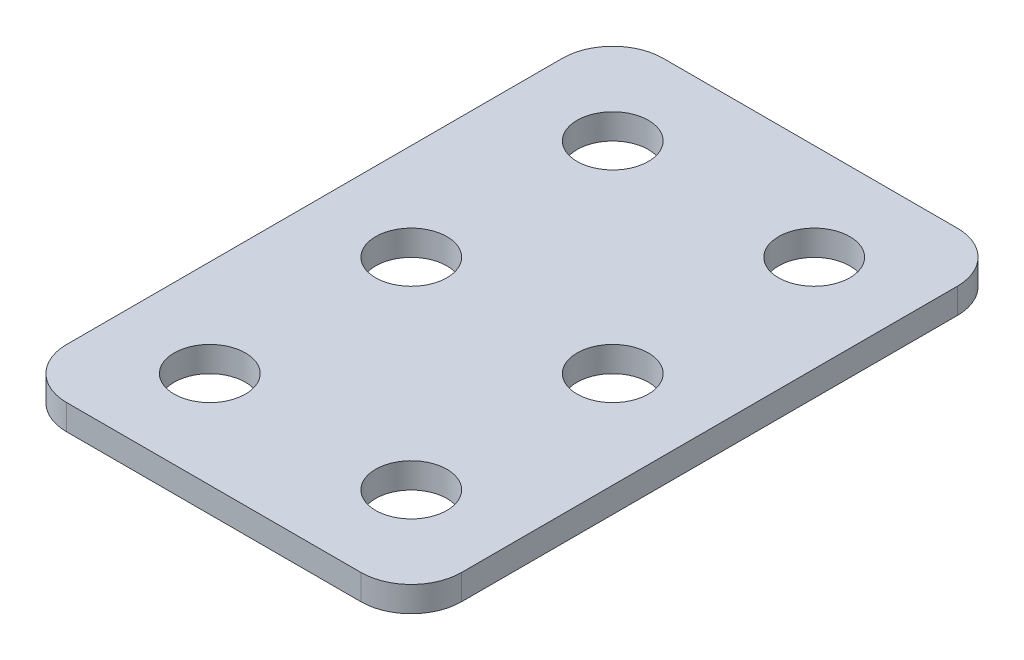
ISO-10303-21;
HEADER;
FILE_DESCRIPTION(('STEP AP214'),'2;1');
FILE_NAME('part.step','',(''),(''),'','','');
FILE_SCHEMA(('AUTOMOTIVE_DESIGN { 1 0 10303 214 1 1 1 1 }'));
ENDSEC;
DATA;
#1=APPLICATION_CONTEXT('core data for automotive mechanical design processes');
#2=APPLICATION_PROTOCOL_DEFINITION('international standard','automotive_design',2000,#1);
#3=PRODUCT_CONTEXT('',#1,'mechanical');
#4=PRODUCT('Part','Part','',(#3));
#5=PRODUCT_RELATED_PRODUCT_CATEGORY('part','',(#4));
#6=PRODUCT_DEFINITION_FORMATION('','',#4);
#7=PRODUCT_DEFINITION_CONTEXT('part definition',#1,'design');
#8=PRODUCT_DEFINITION('design','',#6,#7);
#9=PRODUCT_DEFINITION_SHAPE('','',#8);
#10=(LENGTH_UNIT() NAMED_UNIT(*) SI_UNIT(.MILLI.,.METRE.));
#11=(NAMED_UNIT(*) PLANE_ANGLE_UNIT() SI_UNIT($,.RADIAN.));
#12=(NAMED_UNIT(*) SI_UNIT($,.STERADIAN.) SOLID_ANGLE_UNIT());
#13=UNCERTAINTY_MEASURE_WITH_UNIT(LENGTH_MEASURE(1.E-05),#10,'distance_accuracy_value','');
#14=(GEOMETRIC_REPRESENTATION_CONTEXT(3) GLOBAL_UNCERTAINTY_ASSIGNED_CONTEXT((#13)) GLOBAL_UNIT_ASSIGNED_CONTEXT((#10,
#11,#12)) REPRESENTATION_CONTEXT('',''));
#15=CARTESIAN_POINT('',(0.,0.,0.));
#16=DIRECTION('',(0.,0.,1.));
#17=DIRECTION('',(1.,0.,0.));
#18=AXIS2_PLACEMENT_3D('',#15,#16,#17);
#19=CARTESIAN_POINT('',(0.,-9.5123,0.));
#20=DIRECTION('',(0.,-1.,0.));
#21=DIRECTION('',(1.,0.,0.));
#22=AXIS2_PLACEMENT_3D('',#19,#20,#21);
#23=PLANE('',#22);
#24=CARTESIAN_POINT('',(-6.35,-9.5123,-25.4));
#25=DIRECTION('',(0.,1.,0.));
#26=DIRECTION('',(-1.,0.,0.));
#27=AXIS2_PLACEMENT_3D('',#24,#25,#26);
#28=CIRCLE('',#27,2.2479);
#29=CARTESIAN_POINT('',(-8.5979,-9.5123,-25.4));
#30=VERTEX_POINT('',#29);
#31=EDGE_CURVE('E125',#30,#30,#28,.T.);
#32=ORIENTED_EDGE('',*,*,#31,.F.);
#33=EDGE_LOOP('',(#32));
#34=FACE_BOUND('',#33,.T.);
#35=CARTESIAN_POINT('',(6.35,-9.5123,-25.4));
#36=DIRECTION('',(0.,1.,0.));
#37=DIRECTION('',(-1.,0.,0.));
#38=AXIS2_PLACEMENT_3D('',#35,#36,#37);
#39=CIRCLE('',#38,2.2479);
#40=CARTESIAN_POINT('',(4.1021,-9.5123,-25.4));
#41=VERTEX_POINT('',#40);
#42=EDGE_CURVE('E185',#41,#41,#39,.T.);
#43=ORIENTED_EDGE('',*,*,#42,.F.);
#44=EDGE_LOOP('',(#43));
#45=FACE_BOUND('',#44,.T.);
#46=CARTESIAN_POINT('',(-6.35,-9.5123,-38.1));
#47=DIRECTION('',(0.,1.,0.));
#48=DIRECTION('',(-1.,0.,0.));
#49=AXIS2_PLACEMENT_3D('',#46,#47,#48);
#50=CIRCLE('',#49,2.2479);
#51=CARTESIAN_POINT('',(-8.5979,-9.5123,-38.1));
#52=VERTEX_POINT('',#51);
#53=EDGE_CURVE('E181',#52,#52,#50,.T.);
#54=ORIENTED_EDGE('',*,*,#53,.F.);
#55=EDGE_LOOP('',(#54));
#56=FACE_BOUND('',#55,.T.);
#57=CARTESIAN_POINT('',(6.35,-9.5123,-38.1));
#58=DIRECTION('',(0.,1.,0.));
#59=DIRECTION('',(-1.,0.,0.));
#60=AXIS2_PLACEMENT_3D('',#57,#58,#59);
#61=CIRCLE('',#60,2.2479);
#62=CARTESIAN_POINT('',(4.1021,-9.5123,-38.1));
#63=VERTEX_POINT('',#62);
#64=EDGE_CURVE('E177',#63,#63,#61,.T.);
#65=ORIENTED_EDGE('',*,*,#64,.F.);
#66=EDGE_LOOP('',(#65));
#67=FACE_BOUND('',#66,.T.);
#68=CARTESIAN_POINT('',(-6.35,-9.5123,-50.8));
#69=DIRECTION('',(0.,1.,0.));
#70=DIRECTION('',(-1.,0.,0.));
#71=AXIS2_PLACEMENT_3D('',#68,#69,#70);
#72=CIRCLE('',#71,2.2479);
#73=CARTESIAN_POINT('',(-8.5979,-9.5123,-50.8));
#74=VERTEX_POINT('',#73);
#75=EDGE_CURVE('E173',#74,#74,#72,.T.);
#76=ORIENTED_EDGE('',*,*,#75,.F.);
#77=EDGE_LOOP('',(#76));
#78=FACE_BOUND('',#77,.T.);
#79=CARTESIAN_POINT('',(6.35,-9.5123,-50.8));
#80=DIRECTION('',(0.,1.,0.));
#81=DIRECTION('',(-1.,0.,0.));
#82=AXIS2_PLACEMENT_3D('',#79,#80,#81);
#83=CIRCLE('',#82,2.2479);
#84=CARTESIAN_POINT('',(4.1021,-9.5123,-50.8));
#85=VERTEX_POINT('',#84);
#86=EDGE_CURVE('E158',#85,#85,#83,.T.);
#87=ORIENTED_EDGE('',*,*,#86,.F.);
#88=EDGE_LOOP('',(#87));
#89=FACE_BOUND('',#88,.T.);
#90=DIRECTION('',(0.,0.,-1.));
#91=VECTOR('',#90,1.);
#92=CARTESIAN_POINT('',(12.446,-9.5123,-19.304));
#93=LINE('',#92,#91);
#94=CARTESIAN_POINT('',(12.446,-9.5123,-22.479));
#95=VERTEX_POINT('',#94);
#96=CARTESIAN_POINT('',(12.446,-9.5123,-53.721));
#97=VERTEX_POINT('',#96);
#98=EDGE_CURVE('E104',#95,#97,#93,.T.);
#99=ORIENTED_EDGE('',*,*,#98,.T.);
#100=CARTESIAN_POINT('',(9.271,-9.5123,-53.721));
#101=DIRECTION('',(0.,-1.,0.));
#102=DIRECTION('',(1.,0.,0.));
#103=AXIS2_PLACEMENT_3D('',#100,#101,#102);
#104=CIRCLE('',#103,3.175);
#105=CARTESIAN_POINT('',(9.271,-9.5123,-56.896));
#106=VERTEX_POINT('',#105);
#107=EDGE_CURVE('E134',#97,#106,#104,.F.);
#108=ORIENTED_EDGE('',*,*,#107,.T.);
#109=DIRECTION('',(-1.,0.,0.));
#110=VECTOR('',#109,1.);
#111=CARTESIAN_POINT('',(12.446,-9.5123,-56.896));
#112=LINE('',#111,#110);
#113=CARTESIAN_POINT('',(-9.271,-9.5123,-56.896));
#114=VERTEX_POINT('',#113);
#115=EDGE_CURVE('E164',#106,#114,#112,.T.);
#116=ORIENTED_EDGE('',*,*,#115,.T.);
#117=CARTESIAN_POINT('',(-9.271,-9.5123,-53.721));
#118=DIRECTION('',(0.,-1.,0.));
#119=DIRECTION('',(1.,0.,0.));
#120=AXIS2_PLACEMENT_3D('',#117,#118,#119);
#121=CIRCLE('',#120,3.175);
#122=CARTESIAN_POINT('',(-12.446,-9.5123,-53.721));
#123=VERTEX_POINT('',#122);
#124=EDGE_CURVE('E132',#114,#123,#121,.F.);
#125=ORIENTED_EDGE('',*,*,#124,.T.);
#126=DIRECTION('',(0.,0.,1.));
#127=VECTOR('',#126,1.);
#128=CARTESIAN_POINT('',(-12.446,-9.5123,-56.896));
#129=LINE('',#128,#127);
#130=CARTESIAN_POINT('',(-12.446,-9.5123,-22.479));
#131=VERTEX_POINT('',#130);
#132=EDGE_CURVE('E167',#123,#131,#129,.T.);
#133=ORIENTED_EDGE('',*,*,#132,.T.);
#134=CARTESIAN_POINT('',(-9.27099999999999,-9.5123,-22.479));
#135=DIRECTION('',(0.,-1.,0.));
#136=DIRECTION('',(1.,0.,0.));
#137=AXIS2_PLACEMENT_3D('',#134,#135,#136);
#138=CIRCLE('',#137,3.175);
#139=CARTESIAN_POINT('',(-9.27099999999999,-9.5123,-19.304));
#140=VERTEX_POINT('',#139);
#141=EDGE_CURVE('E110',#131,#140,#138,.F.);
#142=ORIENTED_EDGE('',*,*,#141,.T.);
#143=DIRECTION('',(1.,0.,0.));
#144=VECTOR('',#143,1.);
#145=CARTESIAN_POINT('',(-12.446,-9.5123,-19.304));
#146=LINE('',#145,#144);
#147=CARTESIAN_POINT('',(9.271,-9.5123,-19.304));
#148=VERTEX_POINT('',#147);
#149=EDGE_CURVE('E105',#140,#148,#146,.T.);
#150=ORIENTED_EDGE('',*,*,#149,.T.);
#151=CARTESIAN_POINT('',(9.271,-9.5123,-22.479));
#152=DIRECTION('',(0.,-1.,0.));
#153=DIRECTION('',(1.,0.,0.));
#154=AXIS2_PLACEMENT_3D('',#151,#152,#153);
#155=CIRCLE('',#154,3.175);
#156=EDGE_CURVE('E102',#148,#95,#155,.F.);
#157=ORIENTED_EDGE('',*,*,#156,.T.);
#158=EDGE_LOOP('',(#99,#108,#116,#125,#133,#142,#150,#157));
#159=FACE_BOUND('',#158,.T.);
#160=ADVANCED_FACE('F37',(#34,#45,#56,#67,#78,#89,#159),#23,.F.);
#161=CARTESIAN_POINT('',(0.,-11.1125,0.));
#162=DIRECTION('',(0.,-1.,0.));
#163=DIRECTION('',(1.,0.,0.));
#164=AXIS2_PLACEMENT_3D('',#161,#162,#163);
#165=PLANE('',#164);
#166=CARTESIAN_POINT('',(-6.35,-11.1125,-25.4));
#167=DIRECTION('',(0.,-1.,0.));
#168=DIRECTION('',(1.,0.,0.));
#169=AXIS2_PLACEMENT_3D('',#166,#167,#168);
#170=CIRCLE('',#169,2.2479);
#171=CARTESIAN_POINT('',(-4.1021,-11.1125,-25.4));
#172=VERTEX_POINT('',#171);
#173=EDGE_CURVE('E121',#172,#172,#170,.T.);
#174=ORIENTED_EDGE('',*,*,#173,.F.);
#175=EDGE_LOOP('',(#174));
#176=FACE_BOUND('',#175,.T.);
#177=CARTESIAN_POINT('',(6.35,-11.1125,-25.4));
#178=DIRECTION('',(0.,-1.,0.));
#179=DIRECTION('',(1.,0.,0.));
#180=AXIS2_PLACEMENT_3D('',#177,#178,#179);
#181=CIRCLE('',#180,2.2479);
#182=CARTESIAN_POINT('',(8.5979,-11.1125,-25.4));
#183=VERTEX_POINT('',#182);
#184=EDGE_CURVE('E188',#183,#183,#181,.T.);
#185=ORIENTED_EDGE('',*,*,#184,.F.);
#186=EDGE_LOOP('',(#185));
#187=FACE_BOUND('',#186,.T.);
#188=CARTESIAN_POINT('',(-6.35,-11.1125,-38.1));
#189=DIRECTION('',(0.,-1.,0.));
#190=DIRECTION('',(1.,0.,0.));
#191=AXIS2_PLACEMENT_3D('',#188,#189,#190);
#192=CIRCLE('',#191,2.2479);
#193=CARTESIAN_POINT('',(-4.1021,-11.1125,-38.1));
#194=VERTEX_POINT('',#193);
#195=EDGE_CURVE('E184',#194,#194,#192,.T.);
#196=ORIENTED_EDGE('',*,*,#195,.F.);
#197=EDGE_LOOP('',(#196));
#198=FACE_BOUND('',#197,.T.);
#199=CARTESIAN_POINT('',(6.35,-11.1125,-38.1));
#200=DIRECTION('',(0.,-1.,0.));
#201=DIRECTION('',(1.,0.,0.));
#202=AXIS2_PLACEMENT_3D('',#199,#200,#201);
#203=CIRCLE('',#202,2.2479);
#204=CARTESIAN_POINT('',(8.5979,-11.1125,-38.1));
#205=VERTEX_POINT('',#204);
#206=EDGE_CURVE('E180',#205,#205,#203,.T.);
#207=ORIENTED_EDGE('',*,*,#206,.F.);
#208=EDGE_LOOP('',(#207));
#209=FACE_BOUND('',#208,.T.);
#210=CARTESIAN_POINT('',(-6.35,-11.1125,-50.8));
#211=DIRECTION('',(0.,-1.,0.));
#212=DIRECTION('',(1.,0.,0.));
#213=AXIS2_PLACEMENT_3D('',#210,#211,#212);
#214=CIRCLE('',#213,2.2479);
#215=CARTESIAN_POINT('',(-4.1021,-11.1125,-50.8));
#216=VERTEX_POINT('',#215);
#217=EDGE_CURVE('E176',#216,#216,#214,.T.);
#218=ORIENTED_EDGE('',*,*,#217,.F.);
#219=EDGE_LOOP('',(#218));
#220=FACE_BOUND('',#219,.T.);
#221=CARTESIAN_POINT('',(6.35,-11.1125,-50.8));
#222=DIRECTION('',(0.,-1.,0.));
#223=DIRECTION('',(1.,0.,0.));
#224=AXIS2_PLACEMENT_3D('',#221,#222,#223);
#225=CIRCLE('',#224,2.2479);
#226=CARTESIAN_POINT('',(8.5979,-11.1125,-50.8));
#227=VERTEX_POINT('',#226);
#228=EDGE_CURVE('E128',#227,#227,#225,.T.);
#229=ORIENTED_EDGE('',*,*,#228,.F.);
#230=EDGE_LOOP('',(#229));
#231=FACE_BOUND('',#230,.T.);
#232=DIRECTION('',(-1.,0.,0.));
#233=VECTOR('',#232,1.);
#234=CARTESIAN_POINT('',(12.446,-11.1125,-56.896));
#235=LINE('',#234,#233);
#236=CARTESIAN_POINT('',(9.271,-11.1125,-56.896));
#237=VERTEX_POINT('',#236);
#238=CARTESIAN_POINT('',(-9.271,-11.1125,-56.896));
#239=VERTEX_POINT('',#238);
#240=EDGE_CURVE('E119',#237,#239,#235,.T.);
#241=ORIENTED_EDGE('',*,*,#240,.F.);
#242=CARTESIAN_POINT('',(9.271,-11.1125,-53.721));
#243=DIRECTION('',(0.,-1.,0.));
#244=DIRECTION('',(1.,0.,0.));
#245=AXIS2_PLACEMENT_3D('',#242,#243,#244);
#246=CIRCLE('',#245,3.175);
#247=CARTESIAN_POINT('',(12.446,-11.1125,-53.721));
#248=VERTEX_POINT('',#247);
#249=EDGE_CURVE('E146',#237,#248,#246,.T.);
#250=ORIENTED_EDGE('',*,*,#249,.T.);
#251=DIRECTION('',(0.,0.,-1.));
#252=VECTOR('',#251,1.);
#253=CARTESIAN_POINT('',(12.446,-11.1125,-19.304));
#254=LINE('',#253,#252);
#255=CARTESIAN_POINT('',(12.446,-11.1125,-22.479));
#256=VERTEX_POINT('',#255);
#257=EDGE_CURVE('E155',#256,#248,#254,.T.);
#258=ORIENTED_EDGE('',*,*,#257,.F.);
#259=CARTESIAN_POINT('',(9.271,-11.1125,-22.479));
#260=DIRECTION('',(0.,-1.,0.));
#261=DIRECTION('',(1.,0.,0.));
#262=AXIS2_PLACEMENT_3D('',#259,#260,#261);
#263=CIRCLE('',#262,3.175);
#264=CARTESIAN_POINT('',(9.271,-11.1125,-19.304));
#265=VERTEX_POINT('',#264);
#266=EDGE_CURVE('E52',#256,#265,#263,.T.);
#267=ORIENTED_EDGE('',*,*,#266,.T.);
#268=DIRECTION('',(1.,0.,0.));
#269=VECTOR('',#268,1.);
#270=CARTESIAN_POINT('',(-12.446,-11.1125,-19.304));
#271=LINE('',#270,#269);
#272=CARTESIAN_POINT('',(-9.27099999999999,-11.1125,-19.304));
#273=VERTEX_POINT('',#272);
#274=EDGE_CURVE('E153',#273,#265,#271,.T.);
#275=ORIENTED_EDGE('',*,*,#274,.F.);
#276=CARTESIAN_POINT('',(-9.27099999999999,-11.1125,-22.479));
#277=DIRECTION('',(0.,-1.,0.));
#278=DIRECTION('',(1.,0.,0.));
#279=AXIS2_PLACEMENT_3D('',#276,#277,#278);
#280=CIRCLE('',#279,3.175);
#281=CARTESIAN_POINT('',(-12.446,-11.1125,-22.479));
#282=VERTEX_POINT('',#281);
#283=EDGE_CURVE('E142',#273,#282,#280,.T.);
#284=ORIENTED_EDGE('',*,*,#283,.T.);
#285=DIRECTION('',(0.,0.,1.));
#286=VECTOR('',#285,1.);
#287=CARTESIAN_POINT('',(-12.446,-11.1125,-56.896));
#288=LINE('',#287,#286);
#289=CARTESIAN_POINT('',(-12.446,-11.1125,-53.721));
#290=VERTEX_POINT('',#289);
#291=EDGE_CURVE('E156',#290,#282,#288,.T.);
#292=ORIENTED_EDGE('',*,*,#291,.F.);
#293=CARTESIAN_POINT('',(-9.271,-11.1125,-53.721));
#294=DIRECTION('',(0.,-1.,0.));
#295=DIRECTION('',(1.,0.,0.));
#296=AXIS2_PLACEMENT_3D('',#293,#294,#295);
#297=CIRCLE('',#296,3.175);
#298=EDGE_CURVE('E144',#290,#239,#297,.T.);
#299=ORIENTED_EDGE('',*,*,#298,.T.);
#300=EDGE_LOOP('',(#241,#250,#258,#267,#275,#284,#292,#299));
#301=FACE_BOUND('',#300,.T.);
#302=ADVANCED_FACE('F202',(#176,#187,#198,#209,#220,#231,#301),#165,.T.);
#303=CARTESIAN_POINT('',(-6.35,-19.05,-25.4));
#304=DIRECTION('',(0.,1.,0.));
#305=DIRECTION('',(-1.,0.,0.));
#306=AXIS2_PLACEMENT_3D('',#303,#304,#305);
#307=CYLINDRICAL_SURFACE('',#306,2.2479);
#308=ORIENTED_EDGE('',*,*,#173,.T.);
#309=EDGE_LOOP('',(#308));
#310=FACE_BOUND('',#309,.T.);
#311=ORIENTED_EDGE('',*,*,#31,.T.);
#312=EDGE_LOOP('',(#311));
#313=FACE_BOUND('',#312,.T.);
#314=ADVANCED_FACE('F205',(#310,#313),#307,.F.);
#315=CARTESIAN_POINT('',(6.35,-19.05,-25.4));
#316=DIRECTION('',(0.,1.,0.));
#317=DIRECTION('',(-1.,0.,0.));
#318=AXIS2_PLACEMENT_3D('',#315,#316,#317);
#319=CYLINDRICAL_SURFACE('',#318,2.2479);
#320=ORIENTED_EDGE('',*,*,#184,.T.);
#321=EDGE_LOOP('',(#320));
#322=FACE_BOUND('',#321,.T.);
#323=ORIENTED_EDGE('',*,*,#42,.T.);
#324=EDGE_LOOP('',(#323));
#325=FACE_BOUND('',#324,.T.);
#326=ADVANCED_FACE('F272',(#322,#325),#319,.F.);
#327=CARTESIAN_POINT('',(-6.35,-19.05,-38.1));
#328=DIRECTION('',(0.,1.,0.));
#329=DIRECTION('',(-1.,0.,0.));
#330=AXIS2_PLACEMENT_3D('',#327,#328,#329);
#331=CYLINDRICAL_SURFACE('',#330,2.2479);
#332=ORIENTED_EDGE('',*,*,#195,.T.);
#333=EDGE_LOOP('',(#332));
#334=FACE_BOUND('',#333,.T.);
#335=ORIENTED_EDGE('',*,*,#53,.T.);
#336=EDGE_LOOP('',(#335));
#337=FACE_BOUND('',#336,.T.);
#338=ADVANCED_FACE('F269',(#334,#337),#331,.F.);
#339=CARTESIAN_POINT('',(6.35,-19.05,-38.1));
#340=DIRECTION('',(0.,1.,0.));
#341=DIRECTION('',(-1.,0.,0.));
#342=AXIS2_PLACEMENT_3D('',#339,#340,#341);
#343=CYLINDRICAL_SURFACE('',#342,2.2479);
#344=ORIENTED_EDGE('',*,*,#206,.T.);
#345=EDGE_LOOP('',(#344));
#346=FACE_BOUND('',#345,.T.);
#347=ORIENTED_EDGE('',*,*,#64,.T.);
#348=EDGE_LOOP('',(#347));
#349=FACE_BOUND('',#348,.T.);
#350=ADVANCED_FACE('F266',(#346,#349),#343,.F.);
#351=CARTESIAN_POINT('',(-6.35,-19.05,-50.8));
#352=DIRECTION('',(0.,1.,0.));
#353=DIRECTION('',(-1.,0.,0.));
#354=AXIS2_PLACEMENT_3D('',#351,#352,#353);
#355=CYLINDRICAL_SURFACE('',#354,2.2479);
#356=ORIENTED_EDGE('',*,*,#217,.T.);
#357=EDGE_LOOP('',(#356));
#358=FACE_BOUND('',#357,.T.);
#359=ORIENTED_EDGE('',*,*,#75,.T.);
#360=EDGE_LOOP('',(#359));
#361=FACE_BOUND('',#360,.T.);
#362=ADVANCED_FACE('F199',(#358,#361),#355,.F.);
#363=CARTESIAN_POINT('',(6.35,-19.05,-50.8));
#364=DIRECTION('',(0.,1.,0.));
#365=DIRECTION('',(-1.,0.,0.));
#366=AXIS2_PLACEMENT_3D('',#363,#364,#365);
#367=CYLINDRICAL_SURFACE('',#366,2.2479);
#368=ORIENTED_EDGE('',*,*,#228,.T.);
#369=EDGE_LOOP('',(#368));
#370=FACE_BOUND('',#369,.T.);
#371=ORIENTED_EDGE('',*,*,#86,.T.);
#372=EDGE_LOOP('',(#371));
#373=FACE_BOUND('',#372,.T.);
#374=ADVANCED_FACE('F260',(#370,#373),#367,.F.);
#375=CARTESIAN_POINT('',(12.446,-11.1125,-56.896));
#376=DIRECTION('',(0.,0.,-1.));
#377=DIRECTION('',(-1.,0.,0.));
#378=AXIS2_PLACEMENT_3D('',#375,#376,#377);
#379=PLANE('',#378);
#380=ORIENTED_EDGE('',*,*,#115,.F.);
#381=DIRECTION('',(0.,1.,0.));
#382=VECTOR('',#381,1.);
#383=CARTESIAN_POINT('',(9.271,-11.1125,-56.896));
#384=LINE('',#383,#382);
#385=EDGE_CURVE('E139',#106,#237,#384,.F.);
#386=ORIENTED_EDGE('',*,*,#385,.T.);
#387=ORIENTED_EDGE('',*,*,#240,.T.);
#388=DIRECTION('',(0.,1.,0.));
#389=VECTOR('',#388,1.);
#390=CARTESIAN_POINT('',(-9.271,-11.1125,-56.896));
#391=LINE('',#390,#389);
#392=EDGE_CURVE('E136',#239,#114,#391,.T.);
#393=ORIENTED_EDGE('',*,*,#392,.T.);
#394=EDGE_LOOP('',(#380,#386,#387,#393));
#395=FACE_BOUND('',#394,.T.);
#396=ADVANCED_FACE('F221',(#395),#379,.T.);
#397=CARTESIAN_POINT('',(12.446,-11.1125,-19.304));
#398=DIRECTION('',(1.,0.,0.));
#399=DIRECTION('',(0.,1.,0.));
#400=AXIS2_PLACEMENT_3D('',#397,#398,#399);
#401=PLANE('',#400);
#402=ORIENTED_EDGE('',*,*,#257,.T.);
#403=DIRECTION('',(0.,1.,0.));
#404=VECTOR('',#403,1.);
#405=CARTESIAN_POINT('',(12.446,-11.1125,-53.721));
#406=LINE('',#405,#404);
#407=EDGE_CURVE('E111',#248,#97,#406,.T.);
#408=ORIENTED_EDGE('',*,*,#407,.T.);
#409=ORIENTED_EDGE('',*,*,#98,.F.);
#410=DIRECTION('',(0.,1.,0.));
#411=VECTOR('',#410,1.);
#412=CARTESIAN_POINT('',(12.446,-11.1125,-22.479));
#413=LINE('',#412,#411);
#414=EDGE_CURVE('E117',#95,#256,#413,.F.);
#415=ORIENTED_EDGE('',*,*,#414,.T.);
#416=EDGE_LOOP('',(#402,#408,#409,#415));
#417=FACE_BOUND('',#416,.T.);
#418=ADVANCED_FACE('F116',(#417),#401,.T.);
#419=CARTESIAN_POINT('',(-12.446,-11.1125,-19.304));
#420=DIRECTION('',(0.,0.,1.));
#421=DIRECTION('',(1.,0.,0.));
#422=AXIS2_PLACEMENT_3D('',#419,#420,#421);
#423=PLANE('',#422);
#424=ORIENTED_EDGE('',*,*,#149,.F.);
#425=DIRECTION('',(0.,1.,0.));
#426=VECTOR('',#425,1.);
#427=CARTESIAN_POINT('',(-9.27099999999999,-11.1125,-19.304));
#428=LINE('',#427,#426);
#429=EDGE_CURVE('E11',#140,#273,#428,.F.);
#430=ORIENTED_EDGE('',*,*,#429,.T.);
#431=ORIENTED_EDGE('',*,*,#274,.T.);
#432=DIRECTION('',(0.,1.,0.));
#433=VECTOR('',#432,1.);
#434=CARTESIAN_POINT('',(9.271,-11.1125,-19.304));
#435=LINE('',#434,#433);
#436=EDGE_CURVE('E45',#265,#148,#435,.T.);
#437=ORIENTED_EDGE('',*,*,#436,.T.);
#438=EDGE_LOOP('',(#424,#430,#431,#437));
#439=FACE_BOUND('',#438,.T.);
#440=ADVANCED_FACE('F152',(#439),#423,.T.);
#441=CARTESIAN_POINT('',(-12.446,-11.1125,-56.896));
#442=DIRECTION('',(-1.,0.,0.));
#443=DIRECTION('',(0.,0.,1.));
#444=AXIS2_PLACEMENT_3D('',#441,#442,#443);
#445=PLANE('',#444);
#446=ORIENTED_EDGE('',*,*,#132,.F.);
#447=DIRECTION('',(0.,1.,0.));
#448=VECTOR('',#447,1.);
#449=CARTESIAN_POINT('',(-12.446,-11.1125,-53.721));
#450=LINE('',#449,#448);
#451=EDGE_CURVE('E151',#123,#290,#450,.F.);
#452=ORIENTED_EDGE('',*,*,#451,.T.);
#453=ORIENTED_EDGE('',*,*,#291,.T.);
#454=DIRECTION('',(0.,1.,0.));
#455=VECTOR('',#454,1.);
#456=CARTESIAN_POINT('',(-12.446,-11.1125,-22.479));
#457=LINE('',#456,#455);
#458=EDGE_CURVE('E148',#282,#131,#457,.T.);
#459=ORIENTED_EDGE('',*,*,#458,.T.);
#460=EDGE_LOOP('',(#446,#452,#453,#459));
#461=FACE_BOUND('',#460,.T.);
#462=ADVANCED_FACE('F227',(#461),#445,.T.);
#463=CARTESIAN_POINT('',(9.271,-11.1125,-53.721));
#464=DIRECTION('',(0.,1.,0.));
#465=DIRECTION('',(-1.,0.,0.));
#466=AXIS2_PLACEMENT_3D('',#463,#464,#465);
#467=CYLINDRICAL_SURFACE('',#466,3.175);
#468=ORIENTED_EDGE('',*,*,#249,.F.);
#469=ORIENTED_EDGE('',*,*,#385,.F.);
#470=ORIENTED_EDGE('',*,*,#107,.F.);
#471=ORIENTED_EDGE('',*,*,#407,.F.);
#472=EDGE_LOOP('',(#468,#469,#470,#471));
#473=FACE_BOUND('',#472,.T.);
#474=ADVANCED_FACE('F219',(#473),#467,.T.);
#475=CARTESIAN_POINT('',(-9.271,-11.1125,-53.721));
#476=DIRECTION('',(0.,1.,0.));
#477=DIRECTION('',(-1.,0.,0.));
#478=AXIS2_PLACEMENT_3D('',#475,#476,#477);
#479=CYLINDRICAL_SURFACE('',#478,3.175);
#480=ORIENTED_EDGE('',*,*,#298,.F.);
#481=ORIENTED_EDGE('',*,*,#451,.F.);
#482=ORIENTED_EDGE('',*,*,#124,.F.);
#483=ORIENTED_EDGE('',*,*,#392,.F.);
#484=EDGE_LOOP('',(#480,#481,#482,#483));
#485=FACE_BOUND('',#484,.T.);
#486=ADVANCED_FACE('F223',(#485),#479,.T.);
#487=CARTESIAN_POINT('',(-9.27099999999999,-11.1125,-22.479));
#488=DIRECTION('',(0.,1.,0.));
#489=DIRECTION('',(-1.,0.,0.));
#490=AXIS2_PLACEMENT_3D('',#487,#488,#489);
#491=CYLINDRICAL_SURFACE('',#490,3.175);
#492=ORIENTED_EDGE('',*,*,#283,.F.);
#493=ORIENTED_EDGE('',*,*,#429,.F.);
#494=ORIENTED_EDGE('',*,*,#141,.F.);
#495=ORIENTED_EDGE('',*,*,#458,.F.);
#496=EDGE_LOOP('',(#492,#493,#494,#495));
#497=FACE_BOUND('',#496,.T.);
#498=ADVANCED_FACE('F230',(#497),#491,.T.);
#499=CARTESIAN_POINT('',(9.271,-11.1125,-22.479));
#500=DIRECTION('',(0.,1.,0.));
#501=DIRECTION('',(-1.,0.,0.));
#502=AXIS2_PLACEMENT_3D('',#499,#500,#501);
#503=CYLINDRICAL_SURFACE('',#502,3.175);
#504=ORIENTED_EDGE('',*,*,#266,.F.);
#505=ORIENTED_EDGE('',*,*,#414,.F.);
#506=ORIENTED_EDGE('',*,*,#156,.F.);
#507=ORIENTED_EDGE('',*,*,#436,.F.);
#508=EDGE_LOOP('',(#504,#505,#506,#507));
#509=FACE_BOUND('',#508,.T.);
#510=ADVANCED_FACE('F39',(#509),#503,.T.);
#511=CLOSED_SHELL('',(#160,#302,#314,#326,#338,#350,#362,#374,#396,#418,#440,#462,#474,#486,
#498,#510));
#512=MANIFOLD_SOLID_BREP('B2',#511);
#513=ADVANCED_BREP_SHAPE_REPRESENTATION('',(#18,#512),#14);
#514=SHAPE_DEFINITION_REPRESENTATION(#9,#513);
ENDSEC;
END-ISO-10303-21;
